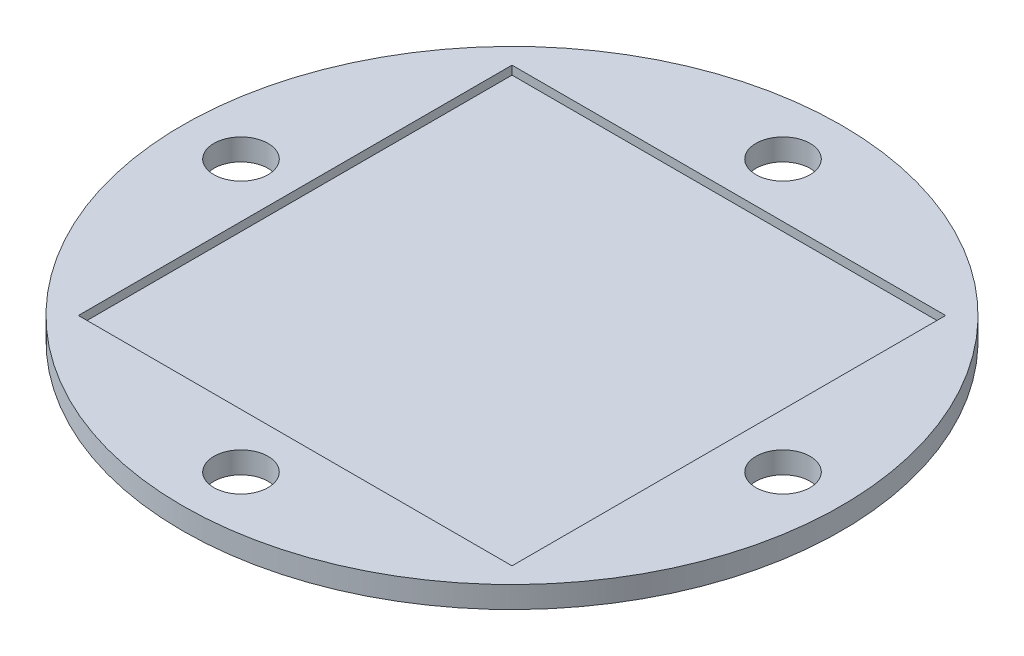
ISO-10303-21;
HEADER;
FILE_DESCRIPTION(('STEP AP214'),'2;1');
FILE_NAME('part.step','',(''),(''),'','','');
FILE_SCHEMA(('AUTOMOTIVE_DESIGN { 1 0 10303 214 1 1 1 1 }'));
ENDSEC;
DATA;
#1=APPLICATION_CONTEXT('core data for automotive mechanical design processes');
#2=APPLICATION_PROTOCOL_DEFINITION('international standard','automotive_design',2000,#1);
#3=PRODUCT_CONTEXT('',#1,'mechanical');
#4=PRODUCT('Part','Part','',(#3));
#5=PRODUCT_RELATED_PRODUCT_CATEGORY('part','',(#4));
#6=PRODUCT_DEFINITION_FORMATION('','',#4);
#7=PRODUCT_DEFINITION_CONTEXT('part definition',#1,'design');
#8=PRODUCT_DEFINITION('design','',#6,#7);
#9=PRODUCT_DEFINITION_SHAPE('','',#8);
#10=(LENGTH_UNIT() NAMED_UNIT(*) SI_UNIT(.MILLI.,.METRE.));
#11=(NAMED_UNIT(*) PLANE_ANGLE_UNIT() SI_UNIT($,.RADIAN.));
#12=(NAMED_UNIT(*) SI_UNIT($,.STERADIAN.) SOLID_ANGLE_UNIT());
#13=UNCERTAINTY_MEASURE_WITH_UNIT(LENGTH_MEASURE(1.E-05),#10,'distance_accuracy_value','');
#14=(GEOMETRIC_REPRESENTATION_CONTEXT(3) GLOBAL_UNCERTAINTY_ASSIGNED_CONTEXT((#13)) GLOBAL_UNIT_ASSIGNED_CONTEXT((#10,
#11,#12)) REPRESENTATION_CONTEXT('',''));
#15=CARTESIAN_POINT('',(0.,0.,0.));
#16=DIRECTION('',(0.,0.,1.));
#17=DIRECTION('',(1.,0.,0.));
#18=AXIS2_PLACEMENT_3D('',#15,#16,#17);
#19=CARTESIAN_POINT('',(0.,5.,0.));
#20=DIRECTION('',(0.,-1.,0.));
#21=DIRECTION('',(0.,0.,-1.));
#22=AXIS2_PLACEMENT_3D('',#19,#20,#21);
#23=CYLINDRICAL_SURFACE('',#22,76.);
#24=CARTESIAN_POINT('',(0.,5.,0.));
#25=DIRECTION('',(0.,1.,0.));
#26=DIRECTION('',(0.,0.,1.));
#27=AXIS2_PLACEMENT_3D('',#24,#25,#26);
#28=CIRCLE('',#27,76.);
#29=CARTESIAN_POINT('',(0.,5.,76.));
#30=VERTEX_POINT('',#29);
#31=EDGE_CURVE('E12',#30,#30,#28,.T.);
#32=ORIENTED_EDGE('',*,*,#31,.F.);
#33=EDGE_LOOP('',(#32));
#34=FACE_BOUND('',#33,.T.);
#35=CARTESIAN_POINT('',(0.,0.,0.));
#36=DIRECTION('',(0.,1.,0.));
#37=DIRECTION('',(0.,0.,1.));
#38=AXIS2_PLACEMENT_3D('',#35,#36,#37);
#39=CIRCLE('',#38,76.);
#40=CARTESIAN_POINT('',(0.,0.,76.));
#41=VERTEX_POINT('',#40);
#42=EDGE_CURVE('E60',#41,#41,#39,.T.);
#43=ORIENTED_EDGE('',*,*,#42,.T.);
#44=EDGE_LOOP('',(#43));
#45=FACE_BOUND('',#44,.T.);
#46=ADVANCED_FACE('F52',(#34,#45),#23,.T.);
#47=CARTESIAN_POINT('',(0.,5.,0.));
#48=DIRECTION('',(0.,1.,0.));
#49=DIRECTION('',(0.,0.,1.));
#50=AXIS2_PLACEMENT_3D('',#47,#48,#49);
#51=PLANE('',#50);
#52=CARTESIAN_POINT('',(0.,5.,-62.5));
#53=DIRECTION('',(0.,1.,0.));
#54=DIRECTION('',(0.,0.,1.));
#55=AXIS2_PLACEMENT_3D('',#52,#53,#54);
#56=CIRCLE('',#55,6.25);
#57=CARTESIAN_POINT('',(0.,5.,-56.25));
#58=VERTEX_POINT('',#57);
#59=EDGE_CURVE('E138',#58,#58,#56,.T.);
#60=ORIENTED_EDGE('',*,*,#59,.F.);
#61=EDGE_LOOP('',(#60));
#62=FACE_BOUND('',#61,.T.);
#63=CARTESIAN_POINT('',(62.5,5.,0.));
#64=DIRECTION('',(0.,1.,0.));
#65=DIRECTION('',(0.,0.,1.));
#66=AXIS2_PLACEMENT_3D('',#63,#64,#65);
#67=CIRCLE('',#66,6.25);
#68=CARTESIAN_POINT('',(62.5,5.,6.25));
#69=VERTEX_POINT('',#68);
#70=EDGE_CURVE('E207',#69,#69,#67,.T.);
#71=ORIENTED_EDGE('',*,*,#70,.F.);
#72=EDGE_LOOP('',(#71));
#73=FACE_BOUND('',#72,.T.);
#74=CARTESIAN_POINT('',(0.,5.,62.5));
#75=DIRECTION('',(0.,1.,0.));
#76=DIRECTION('',(0.,0.,1.));
#77=AXIS2_PLACEMENT_3D('',#74,#75,#76);
#78=CIRCLE('',#77,6.25);
#79=CARTESIAN_POINT('',(0.,5.,68.75));
#80=VERTEX_POINT('',#79);
#81=EDGE_CURVE('E200',#80,#80,#78,.T.);
#82=ORIENTED_EDGE('',*,*,#81,.F.);
#83=EDGE_LOOP('',(#82));
#84=FACE_BOUND('',#83,.T.);
#85=CARTESIAN_POINT('',(-62.5,5.,0.));
#86=DIRECTION('',(0.,1.,0.));
#87=DIRECTION('',(0.,0.,1.));
#88=AXIS2_PLACEMENT_3D('',#85,#86,#87);
#89=CIRCLE('',#88,6.25);
#90=CARTESIAN_POINT('',(-62.5,5.,6.25));
#91=VERTEX_POINT('',#90);
#92=EDGE_CURVE('E208',#91,#91,#89,.T.);
#93=ORIENTED_EDGE('',*,*,#92,.F.);
#94=EDGE_LOOP('',(#93));
#95=FACE_BOUND('',#94,.T.);
#96=DIRECTION('',(0.,0.,-1.));
#97=VECTOR('',#96,1.);
#98=CARTESIAN_POINT('',(50.,5.,50.));
#99=LINE('',#98,#97);
#100=CARTESIAN_POINT('',(50.,5.,50.));
#101=VERTEX_POINT('',#100);
#102=CARTESIAN_POINT('',(50.,5.,-50.));
#103=VERTEX_POINT('',#102);
#104=EDGE_CURVE('E68',#101,#103,#99,.T.);
#105=ORIENTED_EDGE('',*,*,#104,.F.);
#106=DIRECTION('',(1.,0.,0.));
#107=VECTOR('',#106,1.);
#108=CARTESIAN_POINT('',(-50.,5.,50.));
#109=LINE('',#108,#107);
#110=CARTESIAN_POINT('',(-50.,5.,50.));
#111=VERTEX_POINT('',#110);
#112=EDGE_CURVE('E119',#111,#101,#109,.T.);
#113=ORIENTED_EDGE('',*,*,#112,.F.);
#114=DIRECTION('',(0.,0.,1.));
#115=VECTOR('',#114,1.);
#116=CARTESIAN_POINT('',(-50.,5.,50.));
#117=LINE('',#116,#115);
#118=CARTESIAN_POINT('',(-50.,5.,-50.));
#119=VERTEX_POINT('',#118);
#120=EDGE_CURVE('E126',#119,#111,#117,.T.);
#121=ORIENTED_EDGE('',*,*,#120,.F.);
#122=DIRECTION('',(-1.,0.,0.));
#123=VECTOR('',#122,1.);
#124=CARTESIAN_POINT('',(-50.,5.,-50.));
#125=LINE('',#124,#123);
#126=EDGE_CURVE('E103',#103,#119,#125,.T.);
#127=ORIENTED_EDGE('',*,*,#126,.F.);
#128=EDGE_LOOP('',(#105,#113,#121,#127));
#129=FACE_BOUND('',#128,.T.);
#130=ORIENTED_EDGE('',*,*,#31,.T.);
#131=EDGE_LOOP('',(#130));
#132=FACE_BOUND('',#131,.T.);
#133=ADVANCED_FACE('F162',(#62,#73,#84,#95,#129,#132),#51,.T.);
#134=CARTESIAN_POINT('',(0.,0.,0.));
#135=DIRECTION('',(0.,1.,0.));
#136=DIRECTION('',(0.,0.,1.));
#137=AXIS2_PLACEMENT_3D('',#134,#135,#136);
#138=PLANE('',#137);
#139=CARTESIAN_POINT('',(0.,0.,-62.5));
#140=DIRECTION('',(0.,1.,0.));
#141=DIRECTION('',(0.,0.,1.));
#142=AXIS2_PLACEMENT_3D('',#139,#140,#141);
#143=CIRCLE('',#142,6.25);
#144=CARTESIAN_POINT('',(0.,0.,-56.25));
#145=VERTEX_POINT('',#144);
#146=EDGE_CURVE('E55',#145,#145,#143,.T.);
#147=ORIENTED_EDGE('',*,*,#146,.T.);
#148=EDGE_LOOP('',(#147));
#149=FACE_BOUND('',#148,.T.);
#150=CARTESIAN_POINT('',(62.5,0.,0.));
#151=DIRECTION('',(0.,1.,0.));
#152=DIRECTION('',(0.,0.,1.));
#153=AXIS2_PLACEMENT_3D('',#150,#151,#152);
#154=CIRCLE('',#153,6.25);
#155=CARTESIAN_POINT('',(62.5,0.,6.25));
#156=VERTEX_POINT('',#155);
#157=EDGE_CURVE('E140',#156,#156,#154,.T.);
#158=ORIENTED_EDGE('',*,*,#157,.T.);
#159=EDGE_LOOP('',(#158));
#160=FACE_BOUND('',#159,.T.);
#161=CARTESIAN_POINT('',(0.,0.,62.5));
#162=DIRECTION('',(0.,1.,0.));
#163=DIRECTION('',(0.,0.,1.));
#164=AXIS2_PLACEMENT_3D('',#161,#162,#163);
#165=CIRCLE('',#164,6.25);
#166=CARTESIAN_POINT('',(0.,0.,68.75));
#167=VERTEX_POINT('',#166);
#168=EDGE_CURVE('E137',#167,#167,#165,.T.);
#169=ORIENTED_EDGE('',*,*,#168,.T.);
#170=EDGE_LOOP('',(#169));
#171=FACE_BOUND('',#170,.T.);
#172=CARTESIAN_POINT('',(-62.5,0.,0.));
#173=DIRECTION('',(0.,1.,0.));
#174=DIRECTION('',(0.,0.,1.));
#175=AXIS2_PLACEMENT_3D('',#172,#173,#174);
#176=CIRCLE('',#175,6.25);
#177=CARTESIAN_POINT('',(-62.5,0.,6.25));
#178=VERTEX_POINT('',#177);
#179=EDGE_CURVE('E134',#178,#178,#176,.T.);
#180=ORIENTED_EDGE('',*,*,#179,.T.);
#181=EDGE_LOOP('',(#180));
#182=FACE_BOUND('',#181,.T.);
#183=ORIENTED_EDGE('',*,*,#42,.F.);
#184=EDGE_LOOP('',(#183));
#185=FACE_BOUND('',#184,.T.);
#186=ADVANCED_FACE('F147',(#149,#160,#171,#182,#185),#138,.F.);
#187=CARTESIAN_POINT('',(50.,3.,50.));
#188=DIRECTION('',(1.,0.,0.));
#189=DIRECTION('',(0.,0.,-1.));
#190=AXIS2_PLACEMENT_3D('',#187,#188,#189);
#191=PLANE('',#190);
#192=ORIENTED_EDGE('',*,*,#104,.T.);
#193=DIRECTION('',(0.,1.,0.));
#194=VECTOR('',#193,1.);
#195=CARTESIAN_POINT('',(50.,3.,-50.));
#196=LINE('',#195,#194);
#197=CARTESIAN_POINT('',(50.,3.,-50.));
#198=VERTEX_POINT('',#197);
#199=EDGE_CURVE('E91',#198,#103,#196,.T.);
#200=ORIENTED_EDGE('',*,*,#199,.F.);
#201=DIRECTION('',(0.,0.,-1.));
#202=VECTOR('',#201,1.);
#203=CARTESIAN_POINT('',(50.,3.,50.));
#204=LINE('',#203,#202);
#205=CARTESIAN_POINT('',(50.,3.,50.));
#206=VERTEX_POINT('',#205);
#207=EDGE_CURVE('E117',#206,#198,#204,.T.);
#208=ORIENTED_EDGE('',*,*,#207,.F.);
#209=DIRECTION('',(0.,1.,0.));
#210=VECTOR('',#209,1.);
#211=CARTESIAN_POINT('',(50.,3.,50.));
#212=LINE('',#211,#210);
#213=EDGE_CURVE('E76',#206,#101,#212,.T.);
#214=ORIENTED_EDGE('',*,*,#213,.T.);
#215=EDGE_LOOP('',(#192,#200,#208,#214));
#216=FACE_BOUND('',#215,.T.);
#217=ADVANCED_FACE('F174',(#216),#191,.F.);
#218=CARTESIAN_POINT('',(-50.,3.,50.));
#219=DIRECTION('',(0.,0.,1.));
#220=DIRECTION('',(1.,0.,0.));
#221=AXIS2_PLACEMENT_3D('',#218,#219,#220);
#222=PLANE('',#221);
#223=ORIENTED_EDGE('',*,*,#112,.T.);
#224=ORIENTED_EDGE('',*,*,#213,.F.);
#225=DIRECTION('',(1.,0.,0.));
#226=VECTOR('',#225,1.);
#227=CARTESIAN_POINT('',(-50.,3.,50.));
#228=LINE('',#227,#226);
#229=CARTESIAN_POINT('',(-50.,3.,50.));
#230=VERTEX_POINT('',#229);
#231=EDGE_CURVE('E114',#230,#206,#228,.T.);
#232=ORIENTED_EDGE('',*,*,#231,.F.);
#233=DIRECTION('',(0.,1.,0.));
#234=VECTOR('',#233,1.);
#235=CARTESIAN_POINT('',(-50.,3.,50.));
#236=LINE('',#235,#234);
#237=EDGE_CURVE('E107',#230,#111,#236,.T.);
#238=ORIENTED_EDGE('',*,*,#237,.T.);
#239=EDGE_LOOP('',(#223,#224,#232,#238));
#240=FACE_BOUND('',#239,.T.);
#241=ADVANCED_FACE('F178',(#240),#222,.F.);
#242=CARTESIAN_POINT('',(-50.,3.,50.));
#243=DIRECTION('',(-1.,0.,0.));
#244=DIRECTION('',(0.,0.,1.));
#245=AXIS2_PLACEMENT_3D('',#242,#243,#244);
#246=PLANE('',#245);
#247=ORIENTED_EDGE('',*,*,#120,.T.);
#248=ORIENTED_EDGE('',*,*,#237,.F.);
#249=DIRECTION('',(0.,0.,1.));
#250=VECTOR('',#249,1.);
#251=CARTESIAN_POINT('',(-50.,3.,50.));
#252=LINE('',#251,#250);
#253=CARTESIAN_POINT('',(-50.,3.,-50.));
#254=VERTEX_POINT('',#253);
#255=EDGE_CURVE('E110',#254,#230,#252,.T.);
#256=ORIENTED_EDGE('',*,*,#255,.F.);
#257=DIRECTION('',(0.,1.,0.));
#258=VECTOR('',#257,1.);
#259=CARTESIAN_POINT('',(-50.,3.,-50.));
#260=LINE('',#259,#258);
#261=EDGE_CURVE('E96',#254,#119,#260,.T.);
#262=ORIENTED_EDGE('',*,*,#261,.T.);
#263=EDGE_LOOP('',(#247,#248,#256,#262));
#264=FACE_BOUND('',#263,.T.);
#265=ADVANCED_FACE('F111',(#264),#246,.F.);
#266=CARTESIAN_POINT('',(-50.,3.,-50.));
#267=DIRECTION('',(0.,0.,-1.));
#268=DIRECTION('',(-1.,0.,0.));
#269=AXIS2_PLACEMENT_3D('',#266,#267,#268);
#270=PLANE('',#269);
#271=ORIENTED_EDGE('',*,*,#126,.T.);
#272=ORIENTED_EDGE('',*,*,#261,.F.);
#273=DIRECTION('',(-1.,0.,0.));
#274=VECTOR('',#273,1.);
#275=CARTESIAN_POINT('',(-50.,3.,-50.));
#276=LINE('',#275,#274);
#277=EDGE_CURVE('E100',#198,#254,#276,.T.);
#278=ORIENTED_EDGE('',*,*,#277,.F.);
#279=ORIENTED_EDGE('',*,*,#199,.T.);
#280=EDGE_LOOP('',(#271,#272,#278,#279));
#281=FACE_BOUND('',#280,.T.);
#282=ADVANCED_FACE('F98',(#281),#270,.F.);
#283=CARTESIAN_POINT('',(0.,3.,0.));
#284=DIRECTION('',(0.,-1.,0.));
#285=DIRECTION('',(0.,0.,-1.));
#286=AXIS2_PLACEMENT_3D('',#283,#284,#285);
#287=PLANE('',#286);
#288=ORIENTED_EDGE('',*,*,#207,.T.);
#289=ORIENTED_EDGE('',*,*,#277,.T.);
#290=ORIENTED_EDGE('',*,*,#255,.T.);
#291=ORIENTED_EDGE('',*,*,#231,.T.);
#292=EDGE_LOOP('',(#288,#289,#290,#291));
#293=FACE_BOUND('',#292,.T.);
#294=ADVANCED_FACE('F116',(#293),#287,.F.);
#295=CARTESIAN_POINT('',(-62.5,-5.,0.));
#296=DIRECTION('',(0.,1.,0.));
#297=DIRECTION('',(0.,0.,1.));
#298=AXIS2_PLACEMENT_3D('',#295,#296,#297);
#299=CYLINDRICAL_SURFACE('',#298,6.25);
#300=ORIENTED_EDGE('',*,*,#92,.T.);
#301=EDGE_LOOP('',(#300));
#302=FACE_BOUND('',#301,.T.);
#303=ORIENTED_EDGE('',*,*,#179,.F.);
#304=EDGE_LOOP('',(#303));
#305=FACE_BOUND('',#304,.T.);
#306=ADVANCED_FACE('F189',(#302,#305),#299,.F.);
#307=CARTESIAN_POINT('',(0.,-5.,62.5));
#308=DIRECTION('',(0.,1.,0.));
#309=DIRECTION('',(0.,0.,1.));
#310=AXIS2_PLACEMENT_3D('',#307,#308,#309);
#311=CYLINDRICAL_SURFACE('',#310,6.25);
#312=ORIENTED_EDGE('',*,*,#81,.T.);
#313=EDGE_LOOP('',(#312));
#314=FACE_BOUND('',#313,.T.);
#315=ORIENTED_EDGE('',*,*,#168,.F.);
#316=EDGE_LOOP('',(#315));
#317=FACE_BOUND('',#316,.T.);
#318=ADVANCED_FACE('F157',(#314,#317),#311,.F.);
#319=CARTESIAN_POINT('',(62.5,-5.,0.));
#320=DIRECTION('',(0.,1.,0.));
#321=DIRECTION('',(0.,0.,1.));
#322=AXIS2_PLACEMENT_3D('',#319,#320,#321);
#323=CYLINDRICAL_SURFACE('',#322,6.25);
#324=ORIENTED_EDGE('',*,*,#70,.T.);
#325=EDGE_LOOP('',(#324));
#326=FACE_BOUND('',#325,.T.);
#327=ORIENTED_EDGE('',*,*,#157,.F.);
#328=EDGE_LOOP('',(#327));
#329=FACE_BOUND('',#328,.T.);
#330=ADVANCED_FACE('F151',(#326,#329),#323,.F.);
#331=CARTESIAN_POINT('',(0.,-5.,-62.5));
#332=DIRECTION('',(0.,1.,0.));
#333=DIRECTION('',(0.,0.,1.));
#334=AXIS2_PLACEMENT_3D('',#331,#332,#333);
#335=CYLINDRICAL_SURFACE('',#334,6.25);
#336=ORIENTED_EDGE('',*,*,#59,.T.);
#337=EDGE_LOOP('',(#336));
#338=FACE_BOUND('',#337,.T.);
#339=ORIENTED_EDGE('',*,*,#146,.F.);
#340=EDGE_LOOP('',(#339));
#341=FACE_BOUND('',#340,.T.);
#342=ADVANCED_FACE('F149',(#338,#341),#335,.F.);
#343=CLOSED_SHELL('',(#46,#133,#186,#217,#241,#265,#282,#294,#306,#318,#330,#342));
#344=MANIFOLD_SOLID_BREP('B2',#343);
#345=ADVANCED_BREP_SHAPE_REPRESENTATION('',(#18,#344),#14);
#346=SHAPE_DEFINITION_REPRESENTATION(#9,#345);
ENDSEC;
END-ISO-10303-21;
